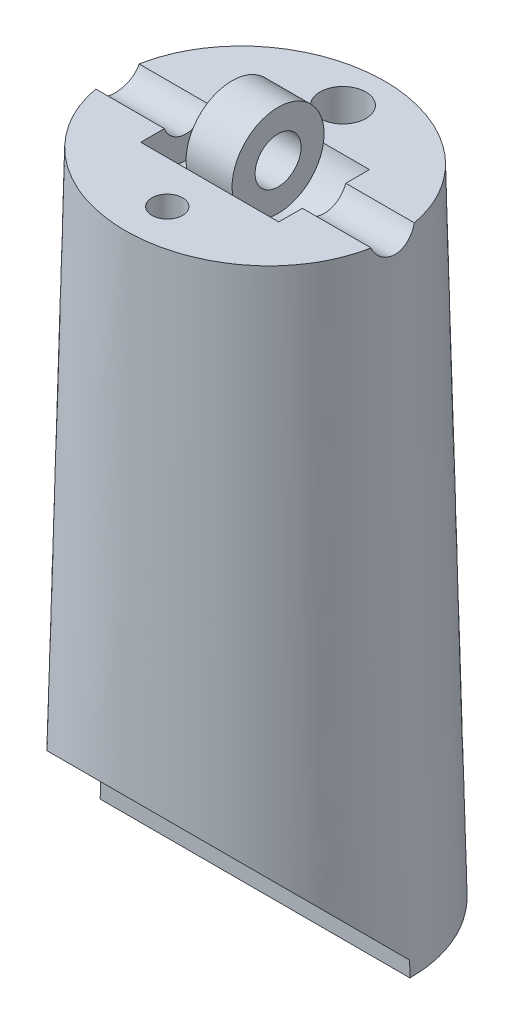
ISO-10303-21;
HEADER;
FILE_DESCRIPTION(('STEP AP214'),'2;1');
FILE_NAME('part.step','',(''),(''),'','','');
FILE_SCHEMA(('AUTOMOTIVE_DESIGN { 1 0 10303 214 1 1 1 1 }'));
ENDSEC;
DATA;
#1=APPLICATION_CONTEXT('core data for automotive mechanical design processes');
#2=APPLICATION_PROTOCOL_DEFINITION('international standard','automotive_design',2000,#1);
#3=PRODUCT_CONTEXT('',#1,'mechanical');
#4=PRODUCT('Part','Part','',(#3));
#5=PRODUCT_RELATED_PRODUCT_CATEGORY('part','',(#4));
#6=PRODUCT_DEFINITION_FORMATION('','',#4);
#7=PRODUCT_DEFINITION_CONTEXT('part definition',#1,'design');
#8=PRODUCT_DEFINITION('design','',#6,#7);
#9=PRODUCT_DEFINITION_SHAPE('','',#8);
#10=(LENGTH_UNIT() NAMED_UNIT(*) SI_UNIT(.MILLI.,.METRE.));
#11=(NAMED_UNIT(*) PLANE_ANGLE_UNIT() SI_UNIT($,.RADIAN.));
#12=(NAMED_UNIT(*) SI_UNIT($,.STERADIAN.) SOLID_ANGLE_UNIT());
#13=UNCERTAINTY_MEASURE_WITH_UNIT(LENGTH_MEASURE(1.E-05),#10,'distance_accuracy_value','');
#14=(GEOMETRIC_REPRESENTATION_CONTEXT(3) GLOBAL_UNCERTAINTY_ASSIGNED_CONTEXT((#13)) GLOBAL_UNIT_ASSIGNED_CONTEXT((#10,
#11,#12)) REPRESENTATION_CONTEXT('',''));
#15=CARTESIAN_POINT('',(0.,0.,0.));
#16=DIRECTION('',(0.,0.,1.));
#17=DIRECTION('',(1.,0.,0.));
#18=AXIS2_PLACEMENT_3D('',#15,#16,#17);
#19=CARTESIAN_POINT('',(-9.09999361964959,41.37,-0.0100033610871483));
#20=DIRECTION('',(0.,-1.,0.));
#21=DIRECTION('',(0.,0.,-1.));
#22=AXIS2_PLACEMENT_3D('',#19,#20,#21);
#23=PLANE('',#22);
#24=CARTESIAN_POINT('',(0.,41.37,-5.72535621924216));
#25=DIRECTION('',(0.,-1.,0.));
#26=DIRECTION('',(0.,0.,-1.));
#27=AXIS2_PLACEMENT_3D('',#24,#25,#26);
#28=CIRCLE('',#27,1.5);
#29=CARTESIAN_POINT('',(0.,41.37,-7.22535621924216));
#30=VERTEX_POINT('',#29);
#31=EDGE_CURVE('E192',#30,#30,#28,.T.);
#32=ORIENTED_EDGE('',*,*,#31,.T.);
#33=EDGE_LOOP('',(#32));
#34=FACE_BOUND('',#33,.T.);
#35=CARTESIAN_POINT('',(9.1,41.37,0.));
#36=CARTESIAN_POINT('',(9.1,41.37,-0.580347464535212));
#37=CARTESIAN_POINT('',(9.036262182866,41.37,-1.14968792087157));
#38=CARTESIAN_POINT('',(8.78760166390898,41.37,-2.26744117898492));
#39=CARTESIAN_POINT('',(8.59918245955483,41.37,-2.82137071074431));
#40=CARTESIAN_POINT('',(8.11621411040861,41.37,-3.86242450305594));
#41=CARTESIAN_POINT('',(7.82205175785362,41.37,-4.35381714198517));
#42=CARTESIAN_POINT('',(7.30325591728863,41.37,-5.04801492446734));
#43=CARTESIAN_POINT('',(7.11776372537932,41.37,-5.27130197974319));
#44=CARTESIAN_POINT('',(6.72911141856353,41.37,-5.6944304001868));
#45=CARTESIAN_POINT('',(6.52508179496951,41.37,-5.89547200287179));
#46=CARTESIAN_POINT('',(6.09822251987625,41.37,-6.2771681393339));
#47=CARTESIAN_POINT('',(5.87539128682259,41.37,-6.4578209580466));
#48=CARTESIAN_POINT('',(5.4109774213921,41.37,-6.79879226022297));
#49=CARTESIAN_POINT('',(5.1685531840289,41.37,-6.95947539316822));
#50=CARTESIAN_POINT('',(4.42726997661481,41.37,-7.40218910955545));
#51=CARTESIAN_POINT('',(3.91068550664822,41.37,-7.64848535396968));
#52=CARTESIAN_POINT('',(2.83456504973987,41.37,-8.04739811454503));
#53=CARTESIAN_POINT('',(2.2715400267804,41.37,-8.19973131789673));
#54=CARTESIAN_POINT('',(1.14345609259285,41.37,-8.39993958430221));
#55=CARTESIAN_POINT('',(0.573861118640256,41.37,-8.45007709935991));
#56=CARTESIAN_POINT('',(-0.288902208630634,41.37,-8.44996131802409));
#57=CARTESIAN_POINT('',(-0.579217858461627,41.37,-8.43710242721147));
#58=CARTESIAN_POINT('',(-1.15290365158946,41.37,-8.38614542752375));
#59=CARTESIAN_POINT('',(-1.43694755965754,41.37,-8.34817124470715));
#60=CARTESIAN_POINT('',(-2.28083086712952,41.37,-8.19742482196623));
#61=CARTESIAN_POINT('',(-2.83249871962043,41.37,-8.0481718820414));
#62=CARTESIAN_POINT('',(-3.6428583314134,41.37,-7.74776372474806));
#63=CARTESIAN_POINT('',(-3.91055675575723,41.37,-7.63440011499916));
#64=CARTESIAN_POINT('',(-4.42883270342353,41.37,-7.38621275584579));
#65=CARTESIAN_POINT('',(-4.68083425525248,41.37,-7.25093145639611));
#66=CARTESIAN_POINT('',(-5.41549884385493,41.37,-6.81163318045704));
#67=CARTESIAN_POINT('',(-5.87704859088978,41.37,-6.47451734017752));
#68=CARTESIAN_POINT('',(-6.52356766834694,41.37,-5.89703518559019));
#69=CARTESIAN_POINT('',(-6.73001887597164,41.37,-5.69347837168897));
#70=CARTESIAN_POINT('',(-7.11785020704172,41.37,-5.27117180780091));
#71=CARTESIAN_POINT('',(-7.30032602983707,41.37,-5.05146884863068));
#72=CARTESIAN_POINT('',(-7.6422544309206,41.37,-4.59485628560837));
#73=CARTESIAN_POINT('',(-7.80170942221602,41.37,-4.35794848514074));
#74=CARTESIAN_POINT('',(-8.09675755989889,41.37,-3.86629950339512));
#75=CARTESIAN_POINT('',(-8.23301164163947,41.37,-3.61009681780752));
#76=CARTESIAN_POINT('',(-8.59867767166947,41.37,-2.82357319218847));
#77=CARTESIAN_POINT('',(-8.78311239947049,41.37,-2.28226367512086));
#78=CARTESIAN_POINT('',(-8.97114354862367,41.37,-1.44497106979003));
#79=CARTESIAN_POINT('',(-9.01894169963419,41.37,-1.16162106746792));
#80=CARTESIAN_POINT('',(-9.08342568435033,41.37,-0.58602899951819));
#81=CARTESIAN_POINT('',(-9.09962770043713,41.37,-0.296854434632156));
#82=CARTESIAN_POINT('',(-9.10072545807449,41.37,0.563698786002849));
#83=CARTESIAN_POINT('',(-9.03914308748032,41.37,1.13278257973101));
#84=CARTESIAN_POINT('',(-8.85210906838486,41.37,1.97939260767821));
#85=CARTESIAN_POINT('',(-8.77386723736832,41.37,2.25940344946825));
#86=CARTESIAN_POINT('',(-8.58967842434559,41.37,2.8037843278194));
#87=CARTESIAN_POINT('',(-8.48339639183719,41.37,3.06981467445096));
#88=CARTESIAN_POINT('',(-8.24316512255972,41.37,3.58986260823514));
#89=CARTESIAN_POINT('',(-8.10921449654737,41.37,3.84387959219541));
#90=CARTESIAN_POINT('',(-7.81349804808534,41.37,4.33983654425585));
#91=CARTESIAN_POINT('',(-7.6515982101994,41.37,4.58157515621352));
#92=CARTESIAN_POINT('',(-7.13554700823715,41.37,5.27306558144373));
#93=CARTESIAN_POINT('',(-6.74815294660519,41.37,5.69513077212638));
#94=CARTESIAN_POINT('',(-6.10445474068028,41.37,6.27202005961662));
#95=CARTESIAN_POINT('',(-5.87843660691769,41.37,6.4554304772424));
#96=CARTESIAN_POINT('',(-5.41419080271481,41.37,6.79658555061589));
#97=CARTESIAN_POINT('',(-5.1751531891278,41.37,6.95519098482289));
#98=CARTESIAN_POINT('',(-4.43806025623445,41.37,7.3964138396821));
#99=CARTESIAN_POINT('',(-3.91822231496955,41.37,7.64546715893285));
#100=CARTESIAN_POINT('',(-2.83350125670802,41.37,8.04801545881971));
#101=CARTESIAN_POINT('',(-2.28030557828265,41.37,8.19760408470408));
#102=CARTESIAN_POINT('',(-1.43509789076522,41.37,8.3484587844185));
#103=CARTESIAN_POINT('',(-1.15077445002991,41.37,8.38640065052205));
#104=CARTESIAN_POINT('',(-0.576878125156588,41.37,8.43724363562835));
#105=CARTESIAN_POINT('',(-0.286383489288407,41.37,8.45004117500427));
#106=CARTESIAN_POINT('',(0.576981367346154,41.37,8.44991734776922));
#107=CARTESIAN_POINT('',(1.14648552503628,41.37,8.39955206726365));
#108=CARTESIAN_POINT('',(1.9917221182124,41.37,8.24931682648944));
#109=CARTESIAN_POINT('',(2.27195457678004,41.37,8.18670938876156));
#110=CARTESIAN_POINT('',(2.82928326786698,41.37,8.03552493677298));
#111=CARTESIAN_POINT('',(3.10562757323284,41.37,7.94698963909361));
#112=CARTESIAN_POINT('',(3.91304314000058,41.37,7.6474642762053));
#113=CARTESIAN_POINT('',(4.42822656494637,41.37,7.40147436959765));
#114=CARTESIAN_POINT('',(5.41129222028968,41.37,6.81464823825979));
#115=CARTESIAN_POINT('',(5.88319516162311,41.37,6.46930076812389));
#116=CARTESIAN_POINT('',(6.73763981133547,41.37,5.70554703540912));
#117=CARTESIAN_POINT('',(7.12437287799347,41.37,5.28593264759849));
#118=CARTESIAN_POINT('',(7.64074799593209,41.37,4.59711743617848));
#119=CARTESIAN_POINT('',(7.80304392743278,41.37,4.35603607538778));
#120=CARTESIAN_POINT('',(8.10019260152301,41.37,3.86025921620274));
#121=CARTESIAN_POINT('',(8.23464651240064,41.37,3.60663318333839));
#122=CARTESIAN_POINT('',(8.5962115761972,41.37,2.82877169479505));
#123=CARTESIAN_POINT('',(8.781984920232,41.37,2.28773929937144));
#124=CARTESIAN_POINT('',(9.03554627275881,41.37,1.15773310511271));
#125=CARTESIAN_POINT('',(9.1,41.37,0.580347464535211));
#126=CARTESIAN_POINT('',(9.1,41.37,0.));
#127=B_SPLINE_CURVE_WITH_KNOTS('',3,(#35,#36,#37,#38,#39,#40,#41,#42,#43,#44,#45,#46,#47,#48,
#49,#50,#51,#52,#53,#54,#55,#56,#57,#58,#59,#60,#61,#62,#63,#64,#65,#66,#67,#68,#69,#70,#71,#72,
#73,#74,#75,#76,#77,#78,#79,#80,#81,#82,#83,#84,#85,#86,#87,#88,#89,#90,#91,#92,#93,#94,#95,#96,
#97,#98,#99,#100,#101,#102,#103,#104,#105,#106,#107,#108,#109,#110,#111,#112,#113,#114,#115,
#116,#117,#118,#119,#120,#121,#122,#123,#124,#125,#126),.UNSPECIFIED.,.T.,.F.,(4,2,2,2,2,2,2,2,
2,2,2,2,2,2,2,2,2,2,2,2,2,2,2,2,2,2,2,2,2,2,2,2,2,2,2,2,2,2,2,2,2,2,2,2,2,4),(0.,
0.0312500000000001,0.0625000000000001,0.0937500000000002,0.109375,0.125,0.140625,0.15625,0.1875,
0.21875,0.25,0.265625,0.28125,0.3125,0.328125,0.34375,0.375,0.390625,0.40625,0.421875,0.4375,
0.46875,0.484375,0.5,0.53125,0.546875,0.5625,0.578125,0.59375,0.625,0.640625,0.65625,0.6875,
0.71875,0.734375,0.75,0.78125,0.796875,0.8125,0.84375,0.875,0.90625,0.921875,0.9375,0.96875,1.),.UNSPECIFIED.);
#128=CARTESIAN_POINT('',(8.97243681910451,41.37,-1.41421264117712));
#129=VERTEX_POINT('',#128);
#130=CARTESIAN_POINT('',(-8.97228566472608,41.37,-1.41421127162772));
#131=VERTEX_POINT('',#130);
#132=EDGE_CURVE('E144',#129,#131,#127,.T.);
#133=ORIENTED_EDGE('',*,*,#132,.T.);
#134=DIRECTION('',(1.,0.,0.));
#135=VECTOR('',#134,1.);
#136=CARTESIAN_POINT('',(-11.0957792956881,41.37,-1.4142135623731));
#137=LINE('',#136,#135);
#138=CARTESIAN_POINT('',(-4.5,41.37,-1.4142135623731));
#139=VERTEX_POINT('',#138);
#140=EDGE_CURVE('E133',#131,#139,#137,.T.);
#141=ORIENTED_EDGE('',*,*,#140,.T.);
#142=DIRECTION('',(0.,0.,-1.));
#143=VECTOR('',#142,1.);
#144=CARTESIAN_POINT('',(-4.5,41.37,-0.0100033610871483));
#145=LINE('',#144,#143);
#146=CARTESIAN_POINT('',(-4.5,41.37,-2.95803989154981));
#147=VERTEX_POINT('',#146);
#148=EDGE_CURVE('E141',#139,#147,#145,.T.);
#149=ORIENTED_EDGE('',*,*,#148,.T.);
#150=DIRECTION('',(1.,0.,0.));
#151=VECTOR('',#150,1.);
#152=CARTESIAN_POINT('',(-4.5,41.37,-2.95803989154981));
#153=LINE('',#152,#151);
#154=CARTESIAN_POINT('',(-1.5,41.37,-2.95803989154981));
#155=VERTEX_POINT('',#154);
#156=EDGE_CURVE('E259',#147,#155,#153,.T.);
#157=ORIENTED_EDGE('',*,*,#156,.T.);
#158=DIRECTION('',(-1.,0.,0.));
#159=VECTOR('',#158,1.);
#160=CARTESIAN_POINT('',(1.5,41.37,-2.95803989154981));
#161=LINE('',#160,#159);
#162=CARTESIAN_POINT('',(1.5,41.37,-2.95803989154981));
#163=VERTEX_POINT('',#162);
#164=EDGE_CURVE('E352',#163,#155,#161,.T.);
#165=ORIENTED_EDGE('',*,*,#164,.F.);
#166=DIRECTION('',(-1.,0.,0.));
#167=VECTOR('',#166,1.);
#168=CARTESIAN_POINT('',(4.5,41.37,-2.95803989154981));
#169=LINE('',#168,#167);
#170=CARTESIAN_POINT('',(4.5,41.37,-2.95803989154981));
#171=VERTEX_POINT('',#170);
#172=EDGE_CURVE('E265',#171,#163,#169,.T.);
#173=ORIENTED_EDGE('',*,*,#172,.F.);
#174=DIRECTION('',(0.,0.,1.));
#175=VECTOR('',#174,1.);
#176=CARTESIAN_POINT('',(4.5,41.37,-0.0100033610871483));
#177=LINE('',#176,#175);
#178=CARTESIAN_POINT('',(4.5,41.37,-1.4142135623731));
#179=VERTEX_POINT('',#178);
#180=EDGE_CURVE('E152',#171,#179,#177,.T.);
#181=ORIENTED_EDGE('',*,*,#180,.T.);
#182=EDGE_CURVE('E73',#179,#129,#137,.T.);
#183=ORIENTED_EDGE('',*,*,#182,.T.);
#184=EDGE_LOOP('',(#133,#141,#149,#157,#165,#173,#181,#183));
#185=FACE_BOUND('',#184,.T.);
#186=ADVANCED_FACE('F55',(#34,#185),#23,.F.);
#187=CARTESIAN_POINT('',(0.,41.37,5.72530197679048));
#188=DIRECTION('',(0.,-1.,0.));
#189=DIRECTION('',(0.,0.,-1.));
#190=AXIS2_PLACEMENT_3D('',#187,#188,#189);
#191=CIRCLE('',#190,1.);
#192=CARTESIAN_POINT('',(0.,41.37,4.72530197679048));
#193=VERTEX_POINT('',#192);
#194=EDGE_CURVE('E191',#193,#193,#191,.T.);
#195=ORIENTED_EDGE('',*,*,#194,.T.);
#196=EDGE_LOOP('',(#195));
#197=FACE_BOUND('',#196,.T.);
#198=CARTESIAN_POINT('',(-8.97225397067662,41.37,1.41421137929553));
#199=VERTEX_POINT('',#198);
#200=CARTESIAN_POINT('',(8.97222319785683,41.37,1.41421199482563));
#201=VERTEX_POINT('',#200);
#202=EDGE_CURVE('E165',#199,#201,#127,.T.);
#203=ORIENTED_EDGE('',*,*,#202,.T.);
#204=DIRECTION('',(1.,0.,0.));
#205=VECTOR('',#204,1.);
#206=CARTESIAN_POINT('',(-11.0957792956881,41.37,1.4142135623731));
#207=LINE('',#206,#205);
#208=CARTESIAN_POINT('',(4.5,41.37,1.4142135623731));
#209=VERTEX_POINT('',#208);
#210=EDGE_CURVE('E208',#201,#209,#207,.F.);
#211=ORIENTED_EDGE('',*,*,#210,.T.);
#212=CARTESIAN_POINT('',(4.5,41.37,2.95803989154981));
#213=VERTEX_POINT('',#212);
#214=EDGE_CURVE('E155',#209,#213,#177,.T.);
#215=ORIENTED_EDGE('',*,*,#214,.T.);
#216=DIRECTION('',(-1.,0.,0.));
#217=VECTOR('',#216,1.);
#218=CARTESIAN_POINT('',(4.5,41.37,2.95803989154981));
#219=LINE('',#218,#217);
#220=CARTESIAN_POINT('',(1.5,41.37,2.95803989154981));
#221=VERTEX_POINT('',#220);
#222=EDGE_CURVE('E269',#221,#213,#219,.F.);
#223=ORIENTED_EDGE('',*,*,#222,.F.);
#224=DIRECTION('',(-1.,0.,0.));
#225=VECTOR('',#224,1.);
#226=CARTESIAN_POINT('',(1.5,41.37,2.95803989154981));
#227=LINE('',#226,#225);
#228=CARTESIAN_POINT('',(-1.5,41.37,2.95803989154981));
#229=VERTEX_POINT('',#228);
#230=EDGE_CURVE('E357',#229,#221,#227,.F.);
#231=ORIENTED_EDGE('',*,*,#230,.F.);
#232=DIRECTION('',(1.,0.,0.));
#233=VECTOR('',#232,1.);
#234=CARTESIAN_POINT('',(-4.5,41.37,2.95803989154981));
#235=LINE('',#234,#233);
#236=CARTESIAN_POINT('',(-4.5,41.37,2.95803989154981));
#237=VERTEX_POINT('',#236);
#238=EDGE_CURVE('E255',#229,#237,#235,.F.);
#239=ORIENTED_EDGE('',*,*,#238,.T.);
#240=CARTESIAN_POINT('',(-4.5,41.37,1.4142135623731));
#241=VERTEX_POINT('',#240);
#242=EDGE_CURVE('E65',#237,#241,#145,.T.);
#243=ORIENTED_EDGE('',*,*,#242,.T.);
#244=EDGE_CURVE('E81',#241,#199,#207,.F.);
#245=ORIENTED_EDGE('',*,*,#244,.T.);
#246=EDGE_LOOP('',(#203,#211,#215,#223,#231,#239,#243,#245));
#247=FACE_BOUND('',#246,.T.);
#248=ADVANCED_FACE('F57',(#197,#247),#23,.F.);
#249=CARTESIAN_POINT('',(0.,0.,0.));
#250=DIRECTION('',(0.,1.,0.));
#251=DIRECTION('',(0.,0.,1.));
#252=AXIS2_PLACEMENT_3D('',#249,#250,#251);
#253=PLANE('',#252);
#254=CARTESIAN_POINT('',(0.,0.,-5.72535621924216));
#255=DIRECTION('',(0.,1.,0.));
#256=DIRECTION('',(0.,0.,1.));
#257=AXIS2_PLACEMENT_3D('',#254,#255,#256);
#258=CIRCLE('',#257,1.5);
#259=CARTESIAN_POINT('',(0.,0.,-4.22535621924216));
#260=VERTEX_POINT('',#259);
#261=EDGE_CURVE('E60',#260,#260,#258,.T.);
#262=ORIENTED_EDGE('',*,*,#261,.T.);
#263=EDGE_LOOP('',(#262));
#264=FACE_BOUND('',#263,.T.);
#265=CARTESIAN_POINT('',(0.,0.,0.));
#266=DIRECTION('',(0.,1.,0.));
#267=DIRECTION('',(-1.,0.,0.));
#268=AXIS2_PLACEMENT_3D('',#265,#266,#267);
#269=ELLIPSE('',#268,10.1,9.45);
#270=CARTESIAN_POINT('',(10.1,0.,0.));
#271=VERTEX_POINT('',#270);
#272=CARTESIAN_POINT('',(-10.0999783273345,0.,0.));
#273=VERTEX_POINT('',#272);
#274=EDGE_CURVE('E282',#271,#273,#269,.T.);
#275=ORIENTED_EDGE('',*,*,#274,.F.);
#276=DIRECTION('',(1.,0.,0.));
#277=VECTOR('',#276,1.);
#278=CARTESIAN_POINT('',(-10.1306474719909,0.,0.));
#279=LINE('',#278,#277);
#280=EDGE_CURVE('E276',#273,#271,#279,.T.);
#281=ORIENTED_EDGE('',*,*,#280,.F.);
#282=EDGE_LOOP('',(#275,#281));
#283=FACE_BOUND('',#282,.T.);
#284=ADVANCED_FACE('F317',(#264,#283),#253,.F.);
#285=CARTESIAN_POINT('',(10.1,0.,0.));
#286=CARTESIAN_POINT('',(9.76666666666667,13.79,0.));
#287=CARTESIAN_POINT('',(9.43333333333333,27.58,0.));
#288=CARTESIAN_POINT('',(9.1,41.37,0.));
#289=CARTESIAN_POINT('',(10.1,0.,-0.130389921094332));
#290=CARTESIAN_POINT('',(9.76666666666667,13.79,-0.125616445031902));
#291=CARTESIAN_POINT('',(9.43333333333333,27.58,-0.120842968969473));
#292=CARTESIAN_POINT('',(9.1,41.37,-0.116069492907043));
#293=CARTESIAN_POINT('',(10.0858737436222,0.,-0.779273416051286));
#294=CARTESIAN_POINT('',(9.75294165711937,13.79,-0.751279665630068));
#295=CARTESIAN_POINT('',(9.42000957061653,27.58,-0.72328591520885));
#296=CARTESIAN_POINT('',(9.08707748411369,41.37,-0.695292164787631));
#297=CARTESIAN_POINT('',(9.91899389838617,0.,-2.04383713923844));
#298=CARTESIAN_POINT('',(9.59056435479727,13.79,-1.97547929142748));
#299=CARTESIAN_POINT('',(9.26213481120838,27.58,-1.90712144361651));
#300=CARTESIAN_POINT('',(8.93370526761949,41.37,-1.83876359580555));
#301=CARTESIAN_POINT('',(9.36258436868433,0.,-3.70492913082597));
#302=CARTESIAN_POINT('',(9.04663332524787,13.79,-3.59139655330119));
#303=CARTESIAN_POINT('',(8.7306822818114,27.58,-3.47786397577641));
#304=CARTESIAN_POINT('',(8.41473123837494,41.37,-3.36433139825164));
#305=CARTESIAN_POINT('',(8.42512662708514,0.,-5.31644736537081));
#306=CARTESIAN_POINT('',(8.12406821247913,13.79,-5.16207989821203));
#307=CARTESIAN_POINT('',(7.82300979787313,27.58,-5.00771243105326));
#308=CARTESIAN_POINT('',(7.52195138326713,41.37,-4.85334496389449));
#309=CARTESIAN_POINT('',(7.18257569619234,0.,-6.72158581625363));
#310=CARTESIAN_POINT('',(6.9048265214771,13.79,-6.5238828794093));
#311=CARTESIAN_POINT('',(6.62707734676187,27.58,-6.32617994256497));
#312=CARTESIAN_POINT('',(6.34932817204664,41.37,-6.12847700572064));
#313=CARTESIAN_POINT('',(5.68468132710744,0.,-7.88228650788105));
#314=CARTESIAN_POINT('',(5.43974938974552,13.79,-7.6390387674443));
#315=CARTESIAN_POINT('',(5.1948174523836,27.58,-7.39579102700755));
#316=CARTESIAN_POINT('',(4.94988551502168,41.37,-7.15254328657081));
#317=CARTESIAN_POINT('',(3.95496943253776,0.,-8.76030094713334));
#318=CARTESIAN_POINT('',(3.76616978005767,13.79,-8.472814309565));
#319=CARTESIAN_POINT('',(3.57737012757758,27.58,-8.18532767199666));
#320=CARTESIAN_POINT('',(3.38857047509749,41.37,-7.89784103442831));
#321=CARTESIAN_POINT('',(2.0666001244506,0.,-9.31773701538679));
#322=CARTESIAN_POINT('',(1.95071490281053,13.79,-8.99485541368581));
#323=CARTESIAN_POINT('',(1.83482968117045,27.58,-8.67197381198482));
#324=CARTESIAN_POINT('',(1.71894445953037,41.37,-8.34909221028384));
#325=CARTESIAN_POINT('',(4.5864593611715E-07,0.,-9.51606832170796));
#326=CARTESIAN_POINT('',(-0.00137524648464856,13.79,-9.17769414159611));
#327=CARTESIAN_POINT('',(-0.00275095161523323,27.58,-8.83931996148425));
#328=CARTESIAN_POINT('',(-0.00412665674581791,41.37,-8.50094578137239));
#329=CARTESIAN_POINT('',(-2.06660130015111,0.,-9.31785433127716));
#330=CARTESIAN_POINT('',(-1.95299319969982,13.79,-8.9945864591611));
#331=CARTESIAN_POINT('',(-1.83938509924852,27.58,-8.67131858704504));
#332=CARTESIAN_POINT('',(-1.72577699879723,41.37,-8.34805071492898));
#333=CARTESIAN_POINT('',(-3.9549674315056,0.,-8.75995896798664));
#334=CARTESIAN_POINT('',(-3.76759187490447,13.79,-8.47199794020148));
#335=CARTESIAN_POINT('',(-3.58021631830335,27.58,-8.18403691241631));
#336=CARTESIAN_POINT('',(-3.39284076170222,41.37,-7.89607588463115));
#337=CARTESIAN_POINT('',(-5.68468495837564,0.,-7.88299526021272));
#338=CARTESIAN_POINT('',(-5.44050735243015,13.79,-7.6388935615273));
#339=CARTESIAN_POINT('',(-5.19632974648466,27.58,-7.39479186284187));
#340=CARTESIAN_POINT('',(-4.95215214053917,41.37,-7.15069016415645));
#341=CARTESIAN_POINT('',(-7.18256897922326,0.,-6.72022628079781));
#342=CARTESIAN_POINT('',(-6.90378897240166,13.79,-6.52393209108786));
#343=CARTESIAN_POINT('',(-6.62500896558006,27.58,-6.32763790137791));
#344=CARTESIAN_POINT('',(-6.34622895875846,41.37,-6.13134371166796));
#345=CARTESIAN_POINT('',(-8.42513906299441,0.,-5.31898608035199));
#346=CARTESIAN_POINT('',(-8.12262238859977,13.79,-5.16515294867757));
#347=CARTESIAN_POINT('',(-7.82010571420514,27.58,-5.01131981700316));
#348=CARTESIAN_POINT('',(-7.5175890398105,41.37,-4.85748668532874));
#349=CARTESIAN_POINT('',(-9.36256181991699,0.,-3.70035034369416));
#350=CARTESIAN_POINT('',(-9.04515876626033,13.79,-3.59235703312478));
#351=CARTESIAN_POINT('',(-8.72775571260367,27.58,-3.48436372255539));
#352=CARTESIAN_POINT('',(-8.41035265894701,41.37,-3.37637041198601));
#353=CARTESIAN_POINT('',(-9.95877455428835,0.,-1.93249268844865));
#354=CARTESIAN_POINT('',(-9.62872973333213,13.79,-1.86674386512808));
#355=CARTESIAN_POINT('',(-9.29868491237592,27.58,-1.80099504180752));
#356=CARTESIAN_POINT('',(-8.9686400914197,41.37,-1.73524621848695));
#357=CARTESIAN_POINT('',(-10.1705477048593,0.,0.));
#358=CARTESIAN_POINT('',(-9.83553477618623,13.79,-0.00433859948019328));
#359=CARTESIAN_POINT('',(-9.50052184751312,27.5799999999999,-0.00867719896038655));
#360=CARTESIAN_POINT('',(-9.16550891884001,41.3699999999999,-0.0130157984405798));
#361=CARTESIAN_POINT('',(-9.95877455428834,0.,1.93249268844864));
#362=CARTESIAN_POINT('',(-9.63052194379868,13.79,1.85880151048046));
#363=CARTESIAN_POINT('',(-9.30226933330902,27.58,1.78511033251229));
#364=CARTESIAN_POINT('',(-8.97401672281937,41.37,1.71141915454412));
#365=CARTESIAN_POINT('',(-9.362561819917,0.,3.70035034369416));
#366=CARTESIAN_POINT('',(-9.04824408892896,13.79,3.5860507517597));
#367=CARTESIAN_POINT('',(-8.73392635794093,27.58,3.47175115982523));
#368=CARTESIAN_POINT('',(-8.41960862695289,41.3700000000001,3.35745156789076));
#369=CARTESIAN_POINT('',(-8.42513906299441,0.,5.31898608035197));
#370=CARTESIAN_POINT('',(-8.12600262694151,13.79,5.16081550990898));
#371=CARTESIAN_POINT('',(-7.8268661908886,27.58,5.00264493946598));
#372=CARTESIAN_POINT('',(-7.5277297548357,41.37,4.84447436902299));
#373=CARTESIAN_POINT('',(-7.18256897922326,0.,6.72022628079782));
#374=CARTESIAN_POINT('',(-6.90666109038852,13.79,6.52151133326607));
#375=CARTESIAN_POINT('',(-6.63075320155379,27.5799999999999,6.32279638573432));
#376=CARTESIAN_POINT('',(-6.35484531271906,41.3699999999999,6.12408143820257));
#377=CARTESIAN_POINT('',(-5.68468495837566,0.,7.8829952602127));
#378=CARTESIAN_POINT('',(-5.44226347453518,13.79,7.63795239203889));
#379=CARTESIAN_POINT('',(-5.19984199069471,27.58,7.39290952386508));
#380=CARTESIAN_POINT('',(-4.95742050685423,41.37,7.14786665569126));
#381=CARTESIAN_POINT('',(-3.9549674315056,0.,8.75995896798667));
#382=CARTESIAN_POINT('',(-3.76807368512744,13.79,8.47195072439181));
#383=CARTESIAN_POINT('',(-3.58117993874928,27.5800000000001,8.18394248079695));
#384=CARTESIAN_POINT('',(-3.39428619237113,41.3700000000001,7.89593423720209));
#385=CARTESIAN_POINT('',(-2.06660130015112,0.,9.31785433127715));
#386=CARTESIAN_POINT('',(-1.95249194156729,13.79,8.99469902033412));
#387=CARTESIAN_POINT('',(-1.83838258298346,27.58,8.67154370939109));
#388=CARTESIAN_POINT('',(-1.72427322439962,41.37,8.34838839844807));
#389=CARTESIAN_POINT('',(4.58645932430862E-07,0.,9.51606832170797));
#390=CARTESIAN_POINT('',(-0.000382575435584072,13.79,9.17765278204098));
#391=CARTESIAN_POINT('',(-0.000765609517100575,27.5799999999999,8.83923724237399));
#392=CARTESIAN_POINT('',(-0.00114864359861708,41.3699999999999,8.500821702707));
#393=CARTESIAN_POINT('',(2.0666001244506,0.,9.3177370153868));
#394=CARTESIAN_POINT('',(1.95150691942473,13.79,8.99476691467677));
#395=CARTESIAN_POINT('',(1.83641371439887,27.58,8.67179681396673));
#396=CARTESIAN_POINT('',(1.72132050937301,41.37,8.3488267132567));
#397=CARTESIAN_POINT('',(3.95496943253776,0.,8.76030094713332));
#398=CARTESIAN_POINT('',(3.76651364338803,13.79,8.47269637930929));
#399=CARTESIAN_POINT('',(3.5780578542383,27.58,8.18509181148526));
#400=CARTESIAN_POINT('',(3.38960206508856,41.37,7.89748724366124));
#401=CARTESIAN_POINT('',(5.68468132710743,0.,7.88228650788108));
#402=CARTESIAN_POINT('',(5.43984216944541,13.79,7.63882004108228));
#403=CARTESIAN_POINT('',(5.19500301178339,27.58,7.39535357428348));
#404=CARTESIAN_POINT('',(4.95016385412136,41.37,7.15188710748467));
#405=CARTESIAN_POINT('',(7.18257569619234,0.,6.72158581625362));
#406=CARTESIAN_POINT('',(6.90345809667734,13.79,6.52509761832796));
#407=CARTESIAN_POINT('',(6.62434049716235,27.5799999999999,6.32860942040231));
#408=CARTESIAN_POINT('',(6.34522289764735,41.3699999999999,6.13212122247665));
#409=CARTESIAN_POINT('',(8.42512662708513,0.,5.31644736537082));
#410=CARTESIAN_POINT('',(8.12241649033758,13.79,5.16372641237615));
#411=CARTESIAN_POINT('',(7.81970635359002,27.58,5.01100545938148));
#412=CARTESIAN_POINT('',(7.51699621684247,41.37,4.8582845063868));
#413=CARTESIAN_POINT('',(9.36258436868432,0.,3.70492913082596));
#414=CARTESIAN_POINT('',(9.04510051521078,13.79,3.59561804941654));
#415=CARTESIAN_POINT('',(8.72761666173724,27.58,3.48630696800711));
#416=CARTESIAN_POINT('',(8.4101328082637,41.37,3.37699588659769));
#417=CARTESIAN_POINT('',(9.91899389838616,0.,2.04383713923845));
#418=CARTESIAN_POINT('',(9.58999762485335,13.79,1.97734111401415));
#419=CARTESIAN_POINT('',(9.26100135132055,27.58,1.91084508878986));
#420=CARTESIAN_POINT('',(8.93200507778776,41.37,1.84434906356556));
#421=CARTESIAN_POINT('',(10.0858737436222,0.,0.779273416051289));
#422=CARTESIAN_POINT('',(9.75289188469707,13.79,0.751448993077818));
#423=CARTESIAN_POINT('',(9.41991002577194,27.58,0.723624570104346));
#424=CARTESIAN_POINT('',(9.08692816684681,41.37,0.695800147130875));
#425=CARTESIAN_POINT('',(10.1,0.,0.130389921094334));
#426=CARTESIAN_POINT('',(9.76666666666667,13.79,0.125616445031904));
#427=CARTESIAN_POINT('',(9.43333333333333,27.58,0.120842968969474));
#428=CARTESIAN_POINT('',(9.1,41.37,0.116069492907043));
#429=CARTESIAN_POINT('',(10.1,0.,0.));
#430=CARTESIAN_POINT('',(9.76666666666667,13.79,0.));
#431=CARTESIAN_POINT('',(9.43333333333333,27.58,0.));
#432=CARTESIAN_POINT('',(9.1,41.37,0.));
#433=B_SPLINE_SURFACE_WITH_KNOTS('',3,3,((#285,#286,#287,#288),(#289,#290,#291,#292),(#293,#294,
#295,#296),(#297,#298,#299,#300),(#301,#302,#303,#304),(#305,#306,#307,#308),(#309,#310,#311,
#312),(#313,#314,#315,#316),(#317,#318,#319,#320),(#321,#322,#323,#324),(#325,#326,#327,#328),
(#329,#330,#331,#332),(#333,#334,#335,#336),(#337,#338,#339,#340),(#341,#342,#343,#344),(#345,
#346,#347,#348),(#349,#350,#351,#352),(#353,#354,#355,#356),(#357,#358,#359,#360),(#361,#362,
#363,#364),(#365,#366,#367,#368),(#369,#370,#371,#372),(#373,#374,#375,#376),(#377,#378,#379,
#380),(#381,#382,#383,#384),(#385,#386,#387,#388),(#389,#390,#391,#392),(#393,#394,#395,#396),
(#397,#398,#399,#400),(#401,#402,#403,#404),(#405,#406,#407,#408),(#409,#410,#411,#412),(#413,
#414,#415,#416),(#417,#418,#419,#420),(#421,#422,#423,#424),(#425,#426,#427,#428),(#429,#430,
#431,#432)),.UNSPECIFIED.,.T.,.F.,.F.,(4,1,1,1,1,1,1,1,1,1,1,1,1,1,1,1,1,1,1,1,1,1,1,1,1,1,1,1,
1,1,1,1,1,1,4),(4,4),(0.,0.00625000000000009,0.03125,0.0625,0.09375,0.125,0.15625,0.1875,
0.21875,0.25,0.28125,0.3125,0.34375,0.375,0.40625,0.4375,0.46875,0.5,0.53125,0.5625,0.59375,
0.625,0.65625,0.6875,0.71875,0.75,0.78125,0.8125,0.84375,0.875,0.90625,0.9375,0.96875,0.99375,
1.),(0.,1.),.UNSPECIFIED.);
#434=CARTESIAN_POINT('',(8.97095474272741,41.37,1.4142135623731));
#435=CARTESIAN_POINT('',(8.97452828324246,41.3299937198987,1.40006878592912));
#436=CARTESIAN_POINT('',(8.97835663561133,41.2906286613301,1.38424068394254));
#437=CARTESIAN_POINT('',(8.98642752560645,41.2134179835879,1.34933194242742));
#438=CARTESIAN_POINT('',(8.99067001180482,41.1755721765726,1.33025170653571));
#439=CARTESIAN_POINT('',(9.0038629089694,41.064772616981,1.26836407457178));
#440=CARTESIAN_POINT('',(9.01329079689883,40.9944272963915,1.22086378099203));
#441=CARTESIAN_POINT('',(9.03248820547096,40.8627843344438,1.11475347366349));
#442=CARTESIAN_POINT('',(9.04225777799402,40.8014880745094,1.0561417667663));
#443=CARTESIAN_POINT('',(9.06117891932023,40.6895821062432,0.929384528515885));
#444=CARTESIAN_POINT('',(9.07033055701375,40.6389712053132,0.861240062531478));
#445=CARTESIAN_POINT('',(9.08712035687149,40.5497633916204,0.717064375100128));
#446=CARTESIAN_POINT('',(9.09475439351253,40.5111990687718,0.641012488885126));
#447=CARTESIAN_POINT('',(9.10768606353499,40.4474476029706,0.483297816790922));
#448=CARTESIAN_POINT('',(9.11298372577827,40.4222602947673,0.401635100238247));
#449=CARTESIAN_POINT('',(9.12060664429327,40.3863981678418,0.236517633171912));
#450=CARTESIAN_POINT('',(9.12298130076107,40.3754819580913,0.15311760459566));
#451=CARTESIAN_POINT('',(9.12466535698001,40.3677288238896,-0.0143574401273414));
#452=CARTESIAN_POINT('',(9.12397519488586,40.3708898869137,-0.0984323580747122));
#453=CARTESIAN_POINT('',(9.11966639854652,40.3910241749975,-0.263514802892873));
#454=CARTESIAN_POINT('',(9.1160928638472,40.407784709848,-0.344549601779494));
#455=CARTESIAN_POINT('',(9.10642908676721,40.4543185610843,-0.502628311548366));
#456=CARTESIAN_POINT('',(9.10033882476182,40.4840919789409,-0.579672191305294));
#457=CARTESIAN_POINT('',(9.08618461228391,40.5560519256933,-0.728294751412278));
#458=CARTESIAN_POINT('',(9.07810517485425,40.5983364089342,-0.799824467761295));
#459=CARTESIAN_POINT('',(9.06078073270534,40.6940497037036,-0.934876157500578));
#460=CARTESIAN_POINT('',(9.05153520688444,40.7474835046692,-0.998394525239448));
#461=CARTESIAN_POINT('',(9.03257051280575,40.8652447104743,-1.11695836526932));
#462=CARTESIAN_POINT('',(9.02284550773199,40.9297741505638,-1.17180195556663));
#463=CARTESIAN_POINT('',(9.00406683911826,41.0671451818625,-1.26985114049586));
#464=CARTESIAN_POINT('',(8.99501216134022,41.1399737737223,-1.3130745890175));
#465=CARTESIAN_POINT('',(8.98399881988486,41.2409565213006,-1.36201496298599));
#466=CARTESIAN_POINT('',(8.98134894373675,41.2663658466129,-1.37346444380097));
#467=CARTESIAN_POINT('',(8.97624640526573,41.3177581830354,-1.3949196968166));
#468=CARTESIAN_POINT('',(8.97379343491536,41.3437402137368,-1.40492774419076));
#469=CARTESIAN_POINT('',(8.97144859144298,41.37,-1.4142135623731));
#470=B_SPLINE_CURVE_WITH_KNOTS('',3,(#434,#435,#436,#437,#438,#439,#440,#441,#442,#443,#444,
#445,#446,#447,#448,#449,#450,#451,#452,#453,#454,#455,#456,#457,#458,#459,#460,#461,#462,#463,
#464,#465,#466,#467,#468,#469),.UNSPECIFIED.,.F.,.F.,(4,2,2,2,2,2,2,2,2,2,2,2,2,2,2,2,2,4),(0.,
0.127668815380748,0.255321796738926,0.510219430442271,0.765155936511307,1.02006397393426,
1.275655764917,1.53124439841594,1.78245137243839,2.03362243439248,2.28093930799909,
2.52825811014863,2.77756696224561,3.02698762288647,3.281555021987,3.53572902346042,
3.61968358097183,3.70350413633831),.UNSPECIFIED.);
#471=EDGE_CURVE('E214',#201,#129,#470,.T.);
#472=CARTESIAN_POINT('',(-8.97114409341658,41.37,-1.41421356237309));
#473=CARTESIAN_POINT('',(-8.97472533749458,41.3299926587824,-1.40006841199672));
#474=CARTESIAN_POINT('',(-8.97856232129939,41.2906266968617,-1.38423988851434));
#475=CARTESIAN_POINT('',(-8.98665230885021,41.2134145443636,-1.34933029463158));
#476=CARTESIAN_POINT('',(-8.99090526069854,41.1755681650265,-1.33024962976007));
#477=CARTESIAN_POINT('',(-9.00413221229936,41.0647676431074,-1.26836096994563));
#478=CARTESIAN_POINT('',(-9.0135864020253,40.9944223537963,-1.22086021763189));
#479=CARTESIAN_POINT('',(-9.03284294479137,40.8627803290564,-1.11474982383259));
#480=CARTESIAN_POINT('',(-9.04264534976708,40.8014849504922,-1.05613851953048));
#481=CARTESIAN_POINT('',(-9.06163689514521,40.689580529413,-0.929382451261867));
#482=CARTESIAN_POINT('',(-9.070826102483,40.638970319218,-0.861238730356835));
#483=CARTESIAN_POINT('',(-9.08769255738586,40.5497603669662,-0.717059386524421));
#484=CARTESIAN_POINT('',(-9.095365580604,40.5111940125602,-0.641002590809014));
#485=CARTESIAN_POINT('',(-9.10836794570923,40.4474398335448,-0.483275985891808));
#486=CARTESIAN_POINT('',(-9.11369731700065,40.4222518410846,-0.40160624712696));
#487=CARTESIAN_POINT('',(-9.1213668403595,40.3863925178029,-0.236481718206546));
#488=CARTESIAN_POINT('',(-9.12375696470456,40.375478298433,-0.153082012305526));
#489=CARTESIAN_POINT('',(-9.12543795662975,40.3677292324689,0.0143920786640512));
#490=CARTESIAN_POINT('',(-9.12472928976695,40.370892270933,0.0984663604911234));
#491=CARTESIAN_POINT('',(-9.12033869133265,40.391024797075,0.26350566713955));
#492=CARTESIAN_POINT('',(-9.11670394086056,40.4077752297272,0.344498833930125));
#493=CARTESIAN_POINT('',(-9.1069064663634,40.4542743823259,0.50249677676352));
#494=CARTESIAN_POINT('',(-9.10074370420496,40.4840232983464,0.579501492623479));
#495=CARTESIAN_POINT('',(-9.08644422354315,40.555932240289,0.728076574568691));
#496=CARTESIAN_POINT('',(-9.0782914123206,40.5981940786765,0.799596051634575));
#497=CARTESIAN_POINT('',(-9.06083165233603,40.6938581236951,0.934633339470862));
#498=CARTESIAN_POINT('',(-9.05152418946596,40.7472653000541,0.998147560348458));
#499=CARTESIAN_POINT('',(-9.03244520120372,40.8649939441145,1.11673363821942));
#500=CARTESIAN_POINT('',(-9.02266803368167,40.9295212266717,1.17159998139455));
#501=CARTESIAN_POINT('',(-9.00379987380847,41.0668948356656,1.26969375502577));
#502=CARTESIAN_POINT('',(-8.99470784522422,41.1397281625427,1.31293902668256));
#503=CARTESIAN_POINT('',(-8.98364952789874,41.2407561180284,1.36192329145232));
#504=CARTESIAN_POINT('',(-8.98098656243337,41.2662040435338,1.37339421675426));
#505=CARTESIAN_POINT('',(-8.97585974249525,41.317675733295,1.39488792899191));
#506=CARTESIAN_POINT('',(-8.97339557689738,41.3436985132526,1.40491299887895));
#507=CARTESIAN_POINT('',(-8.97104047680941,41.37,1.4142135623731));
#508=B_SPLINE_CURVE_WITH_KNOTS('',3,(#472,#473,#474,#475,#476,#477,#478,#479,#480,#481,#482,
#483,#484,#485,#486,#487,#488,#489,#490,#491,#492,#493,#494,#495,#496,#497,#498,#499,#500,#501,
#502,#503,#504,#505,#506,#507),.UNSPECIFIED.,.F.,.F.,(4,2,2,2,2,2,2,2,2,2,2,2,2,2,2,2,2,4),(0.,
0.127674099862696,0.255332290913618,0.510239285901136,0.765184460692256,1.02010176051845,
1.27571958762696,1.53133420756701,1.78254001590081,2.03370808480276,2.28090546751593,
2.5281065791741,2.77737708768644,3.02675898481396,3.28138271393961,3.53561327034271,
3.61970277849638,3.70365802371092),.UNSPECIFIED.);
#509=EDGE_CURVE('E146',#131,#199,#508,.T.);
#510=DIRECTION('',(-0.0241650467155316,0.999707982621543,0.));
#511=VECTOR('',#510,1.);
#512=CARTESIAN_POINT('',(9.6,20.685,0.));
#513=LINE('',#512,#511);
#514=CARTESIAN_POINT('',(10.0758278946096,1.,0.));
#515=VERTEX_POINT('',#514);
#516=EDGE_CURVE('E349',#271,#515,#513,.T.);
#517=CARTESIAN_POINT('',(-10.0758045065753,1.,0.));
#518=CARTESIAN_POINT('',(-10.0838552226065,0.666666666666667,0.));
#519=CARTESIAN_POINT('',(-10.0919059386378,0.333333333333334,0.));
#520=CARTESIAN_POINT('',(-10.099956654669,0.,0.));
#521=B_SPLINE_CURVE_WITH_KNOTS('',3,(#517,#518,#519,#520),.UNSPECIFIED.,.F.,.F.,(4,4),(0.,
1.00029162060748),.UNSPECIFIED.);
#522=CARTESIAN_POINT('',(-10.0758045065753,1.,0.));
#523=VERTEX_POINT('',#522);
#524=EDGE_CURVE('E182',#523,#273,#521,.T.);
#525=CARTESIAN_POINT('',(10.0758278946096,1.,0.));
#526=CARTESIAN_POINT('',(10.0676295675781,1.34013778266717,0.340137782667176));
#527=CARTESIAN_POINT('',(10.0400889709757,1.68012427771292,0.680124277712923));
#528=CARTESIAN_POINT('',(9.94534196261292,2.35770917852686,1.35770917852688));
#529=CARTESIAN_POINT('',(9.87808949115321,2.69530434985258,1.69530434985259));
#530=CARTESIAN_POINT('',(9.70227125658,3.36782345169951,2.36782345169954));
#531=CARTESIAN_POINT('',(9.59338832684887,3.70270620130843,2.70270620130846));
#532=CARTESIAN_POINT('',(9.33359954778721,4.36409622440206,3.3640962244021));
#533=CARTESIAN_POINT('',(9.18271686864595,4.69060800777931,3.69060800777934));
#534=CARTESIAN_POINT('',(8.87985961100523,5.25388377723694,4.25388377723698));
#535=CARTESIAN_POINT('',(8.7371018762409,5.49313728135707,4.49313728135711));
#536=CARTESIAN_POINT('',(8.42634919299322,5.9633340120954,4.96333401209545));
#537=CARTESIAN_POINT('',(8.25835482386501,6.19427742933669,5.19427742933675));
#538=CARTESIAN_POINT('',(7.89717782540978,6.64532139331897,5.64532139331903));
#539=CARTESIAN_POINT('',(7.70406680110141,6.86545040205931,5.86545040205937));
#540=CARTESIAN_POINT('',(7.39521186494972,7.18630400012717,6.18630400012724));
#541=CARTESIAN_POINT('',(7.28906698704135,7.29169434008277,6.29169434008284));
#542=CARTESIAN_POINT('',(7.07030630891059,7.49910934804337,6.49910934804344));
#543=CARTESIAN_POINT('',(6.9576888536791,7.60113314464654,6.60113314464661));
#544=CARTESIAN_POINT('',(6.66260456766211,7.85620450874485,6.85620450874493));
#545=CARTESIAN_POINT('',(6.47560806731057,8.00665633179824,7.00665633179832));
#546=CARTESIAN_POINT('',(6.08603379043098,8.29706052529348,7.29706052529355));
#547=CARTESIAN_POINT('',(5.88346021889356,8.43701570926506,7.43701570926514));
#548=CARTESIAN_POINT('',(5.46293279318668,8.70469933602852,7.7046993360286));
#549=CARTESIAN_POINT('',(5.24498865614156,8.83243538537994,7.83243538538002));
#550=CARTESIAN_POINT('',(4.7943369855875,9.0741863817812,8.07418638178129));
#551=CARTESIAN_POINT('',(4.56163031723408,9.18820213177438,8.18820213177447));
#552=CARTESIAN_POINT('',(4.12449040975514,9.38225437356383,8.38225437356392));
#553=CARTESIAN_POINT('',(3.92223300916841,9.46474583204954,8.46474583204963));
#554=CARTESIAN_POINT('',(3.50917481033585,9.61820778431607,8.61820778431616));
#555=CARTESIAN_POINT('',(3.29837571307756,9.68918055796627,8.68918055796637));
#556=CARTESIAN_POINT('',(2.86912135934521,9.81833425857821,8.81833425857831));
#557=CARTESIAN_POINT('',(2.65066944833831,9.8765206962062,8.87652069620629));
#558=CARTESIAN_POINT('',(2.31825600039409,9.95347054466175,8.95347054466185));
#559=CARTESIAN_POINT('',(2.20664498344494,9.97740170254344,8.97740170254353));
#560=CARTESIAN_POINT('',(1.98202660547819,10.0217275683219,9.02172756832199));
#561=CARTESIAN_POINT('',(1.86901924177327,10.0421222694115,9.04212226941156));
#562=CARTESIAN_POINT('',(1.52726135111699,10.0980943637066,9.09809436370665));
#563=CARTESIAN_POINT('',(1.29668954004214,10.1282477792272,9.1282477792273));
#564=CARTESIAN_POINT('',(0.832646908258189,10.173841359417,9.17384135941708));
#565=CARTESIAN_POINT('',(0.59917610037843,10.1892815891749,9.18928158917505));
#566=CARTESIAN_POINT('',(0.248257298840872,10.2011359741724,9.2011359741725));
#567=CARTESIAN_POINT('',(0.131147298134276,10.2032025499015,9.20320254990158));
#568=CARTESIAN_POINT('',(-0.103082981545822,10.2035120329918,9.2035120329919));
#569=CARTESIAN_POINT('',(-0.220203259376677,10.2017551858385,9.2017551858386));
#570=CARTESIAN_POINT('',(-0.454194154946325,10.194466542717,9.1944665427171));
#571=CARTESIAN_POINT('',(-0.571064799416322,10.1889351735963,9.18893517359636));
#572=CARTESIAN_POINT('',(-0.804355756486675,10.1741441891315,9.1741441891316));
#573=CARTESIAN_POINT('',(-0.920775944670338,10.1648836089734,9.16488360897354));
#574=CARTESIAN_POINT('',(-1.25297354643138,10.1331093741346,9.13310937413473));
#575=CARTESIAN_POINT('',(-1.46791795989922,10.1060518818521,9.10605188185224));
#576=CARTESIAN_POINT('',(-1.89383016506082,10.0393523660552,9.03935236605533));
#577=CARTESIAN_POINT('',(-2.10479808411912,9.99971074633036,8.99971074633046));
#578=CARTESIAN_POINT('',(-2.521337895305,9.90823930390328,8.90823930390337));
#579=CARTESIAN_POINT('',(-2.72691068709707,9.85641152784451,8.8564115278446));
#580=CARTESIAN_POINT('',(-3.13158811328959,9.74137946973413,8.74137946973423));
#581=CARTESIAN_POINT('',(-3.33069193745031,9.67817376902967,8.67817376902977));
#582=CARTESIAN_POINT('',(-3.72784116117935,9.53922256548432,8.53922256548441));
#583=CARTESIAN_POINT('',(-3.925651593489,9.46314223318373,8.46314223318382));
#584=CARTESIAN_POINT('',(-4.31285140733305,9.30096797808133,8.30096797808142));
#585=CARTESIAN_POINT('',(-4.50224102291525,9.21487433382985,8.21487433382994));
#586=CARTESIAN_POINT('',(-4.87208002344345,9.03344302107627,8.03344302107635));
#587=CARTESIAN_POINT('',(-5.05252478912219,8.93810064999954,7.93810064999963));
#588=CARTESIAN_POINT('',(-5.40384823808164,8.73898399766758,7.73898399766766));
#589=CARTESIAN_POINT('',(-5.57472601290687,8.6352089179511,7.63520891795118));
#590=CARTESIAN_POINT('',(-5.98720872545556,8.36782512219973,7.36782512219981));
#591=CARTESIAN_POINT('',(-6.22288602789417,8.19962287927548,7.19962287927557));
#592=CARTESIAN_POINT('',(-6.67260380931869,7.84929706859846,6.84929706859853));
#593=CARTESIAN_POINT('',(-6.88663375193406,7.66716679670194,6.66716679670201));
#594=CARTESIAN_POINT('',(-7.29367692658746,7.29100641474342,6.29100641474349));
#595=CARTESIAN_POINT('',(-7.48665017150241,7.09695472105055,6.09695472105062));
#596=CARTESIAN_POINT('',(-7.85091815543236,6.69900369192766,5.69900369192772));
#597=CARTESIAN_POINT('',(-8.02221579619231,6.49510567969885,5.49510567969891));
#598=CARTESIAN_POINT('',(-8.38821427367383,6.02053603575395,5.02053603575401));
#599=CARTESIAN_POINT('',(-8.57598698493882,5.74718696621865,4.7471869662187));
#600=CARTESIAN_POINT('',(-8.91762113570698,5.19003423468012,4.19003423468016));
#601=CARTESIAN_POINT('',(-9.07146657778837,4.90622571412267,3.90622571412271));
#602=CARTESIAN_POINT('',(-9.34627782952679,4.33076779289761,3.33076779289765));
#603=CARTESIAN_POINT('',(-9.46724215449774,4.03911803882679,3.03911803882682));
#604=CARTESIAN_POINT('',(-9.67592910151152,3.45004978541816,2.45004978541818));
#605=CARTESIAN_POINT('',(-9.76366646775381,3.15263390648605,2.15263390648607));
#606=CARTESIAN_POINT('',(-9.87174879489662,2.69996623306763,1.69996623306765));
#607=CARTESIAN_POINT('',(-9.90409623588006,2.54609206020778,1.5460920602078));
#608=CARTESIAN_POINT('',(-9.96053155107633,2.23760367067447,1.23760367067448));
#609=CARTESIAN_POINT('',(-9.98462061731502,2.08298956407361,1.08298956407362));
#610=CARTESIAN_POINT('',(-10.0245882704296,1.77381330430075,0.773813304300756));
#611=CARTESIAN_POINT('',(-10.0404970022422,1.6192530886366,0.619253088636607));
#612=CARTESIAN_POINT('',(-10.0642237269607,1.30981215748644,0.309812157486447));
#613=CARTESIAN_POINT('',(-10.0720411820141,1.15493142138004,0.154931421380045));
#614=CARTESIAN_POINT('',(-10.0758045065753,1.,0.));
#615=B_SPLINE_CURVE_WITH_KNOTS('',3,(#525,#526,#527,#528,#529,#530,#531,#532,#533,#534,#535,
#536,#537,#538,#539,#540,#541,#542,#543,#544,#545,#546,#547,#548,#549,#550,#551,#552,#553,#554,
#555,#556,#557,#558,#559,#560,#561,#562,#563,#564,#565,#566,#567,#568,#569,#570,#571,#572,#573,
#574,#575,#576,#577,#578,#579,#580,#581,#582,#583,#584,#585,#586,#587,#588,#589,#590,#591,#592,
#593,#594,#595,#596,#597,#598,#599,#600,#601,#602,#603,#604,#605,#606,#607,#608,#609,#610,#611,
#612,#613,#614),.UNSPECIFIED.,.F.,.F.,(4,2,2,2,2,2,2,2,2,2,2,2,2,2,2,2,2,2,2,2,2,2,2,2,2,2,2,2,
2,2,2,2,2,2,2,2,2,2,2,2,2,2,2,2,4),(0.,1.44308139264825,2.88783983567858,4.34383203727818,
5.79902259165733,6.89978073346165,8.0005136091219,9.09817450945949,9.64695911857959,
10.1958846792033,11.0448849603575,11.8936568552343,12.7418968931771,13.5900872660049,
14.2898914401213,14.9895569340842,15.6889202916127,16.0387079888291,16.3884963593311,
17.0909497565078,17.7934000461256,18.1447346876141,18.4960467720897,18.847319134496,
19.1986824358329,19.8528293733787,20.5069553232954,21.1609714922855,21.8150692636223,
22.4899657997944,23.1648435661822,23.8400662952855,24.5153530333367,25.5184065507654,
26.5219459561777,27.527359102261,28.5326375094929,29.8201035742397,31.1081754144738,
32.3963054055538,33.6838631275378,34.3437375896689,35.0035167644151,35.6608468750683,
36.3182206776974),.UNSPECIFIED.);
#616=EDGE_CURVE('E342',#515,#523,#615,.T.);
#617=ORIENTED_EDGE('',*,*,#471,.F.);
#618=ORIENTED_EDGE('',*,*,#202,.F.);
#619=ORIENTED_EDGE('',*,*,#509,.F.);
#620=ORIENTED_EDGE('',*,*,#132,.F.);
#621=EDGE_LOOP('',(#617,#618,#619,#620));
#622=FACE_BOUND('',#621,.T.);
#623=ORIENTED_EDGE('',*,*,#516,.F.);
#624=ORIENTED_EDGE('',*,*,#274,.T.);
#625=ORIENTED_EDGE('',*,*,#524,.F.);
#626=ORIENTED_EDGE('',*,*,#616,.F.);
#627=EDGE_LOOP('',(#623,#624,#625,#626));
#628=FACE_BOUND('',#627,.T.);
#629=ADVANCED_FACE('F225',(#622,#628),#433,.T.);
#630=CARTESIAN_POINT('',(-10.1306474719909,0.500000000000006,-0.5));
#631=DIRECTION('',(0.,0.707106781186551,-0.707106781186544));
#632=DIRECTION('',(0.,0.707106781186544,0.707106781186551));
#633=AXIS2_PLACEMENT_3D('',#630,#631,#632);
#634=PLANE('',#633);
#635=CARTESIAN_POINT('',(0.,6.72530197679042,5.72530197679048));
#636=DIRECTION('',(0.,0.707106781186551,-0.707106781186544));
#637=DIRECTION('',(0.,0.707106781186544,0.707106781186551));
#638=AXIS2_PLACEMENT_3D('',#635,#636,#637);
#639=ELLIPSE('',#638,1.41421356237309,1.);
#640=CARTESIAN_POINT('',(0.,7.72530197679041,6.72530197679048));
#641=VERTEX_POINT('',#640);
#642=EDGE_CURVE('E189',#641,#641,#639,.T.);
#643=ORIENTED_EDGE('',*,*,#642,.T.);
#644=EDGE_LOOP('',(#643));
#645=FACE_BOUND('',#644,.T.);
#646=DIRECTION('',(1.,0.,0.));
#647=VECTOR('',#646,1.);
#648=CARTESIAN_POINT('',(-10.1306474719909,1.,0.));
#649=LINE('',#648,#647);
#650=EDGE_CURVE('E279',#523,#515,#649,.T.);
#651=ORIENTED_EDGE('',*,*,#650,.T.);
#652=ORIENTED_EDGE('',*,*,#616,.T.);
#653=EDGE_LOOP('',(#651,#652));
#654=FACE_BOUND('',#653,.T.);
#655=ADVANCED_FACE('F332',(#645,#654),#634,.F.);
#656=CARTESIAN_POINT('',(-10.1306474719909,0.,0.));
#657=DIRECTION('',(0.,0.,-1.));
#658=DIRECTION('',(-1.,0.,0.));
#659=AXIS2_PLACEMENT_3D('',#656,#657,#658);
#660=PLANE('',#659);
#661=ORIENTED_EDGE('',*,*,#516,.T.);
#662=ORIENTED_EDGE('',*,*,#650,.F.);
#663=ORIENTED_EDGE('',*,*,#524,.T.);
#664=ORIENTED_EDGE('',*,*,#280,.T.);
#665=EDGE_LOOP('',(#661,#662,#663,#664));
#666=FACE_BOUND('',#665,.T.);
#667=ADVANCED_FACE('F327',(#666),#660,.F.);
#668=CARTESIAN_POINT('',(1.5,41.87,0.));
#669=DIRECTION('',(-1.,0.,0.));
#670=DIRECTION('',(0.,0.,1.));
#671=AXIS2_PLACEMENT_3D('',#668,#669,#670);
#672=CYLINDRICAL_SURFACE('',#671,3.);
#673=CARTESIAN_POINT('',(-1.5,41.87,0.));
#674=DIRECTION('',(1.,0.,0.));
#675=DIRECTION('',(0.,0.,-1.));
#676=AXIS2_PLACEMENT_3D('',#673,#674,#675);
#677=CIRCLE('',#676,3.);
#678=EDGE_CURVE('E272',#155,#229,#677,.T.);
#679=ORIENTED_EDGE('',*,*,#678,.T.);
#680=ORIENTED_EDGE('',*,*,#230,.T.);
#681=CARTESIAN_POINT('',(1.5,41.87,0.));
#682=DIRECTION('',(1.,0.,0.));
#683=DIRECTION('',(0.,0.,-1.));
#684=AXIS2_PLACEMENT_3D('',#681,#682,#683);
#685=CIRCLE('',#684,3.);
#686=EDGE_CURVE('E273',#163,#221,#685,.T.);
#687=ORIENTED_EDGE('',*,*,#686,.F.);
#688=ORIENTED_EDGE('',*,*,#164,.T.);
#689=EDGE_LOOP('',(#679,#680,#687,#688));
#690=FACE_BOUND('',#689,.T.);
#691=ADVANCED_FACE('F331',(#690),#672,.T.);
#692=CARTESIAN_POINT('',(1.5,41.87,0.));
#693=DIRECTION('',(1.,0.,0.));
#694=DIRECTION('',(0.,0.,-1.));
#695=AXIS2_PLACEMENT_3D('',#692,#693,#694);
#696=PLANE('',#695);
#697=CARTESIAN_POINT('',(1.5,41.87,0.));
#698=DIRECTION('',(1.,0.,0.));
#699=DIRECTION('',(0.,0.,-1.));
#700=AXIS2_PLACEMENT_3D('',#697,#698,#699);
#701=CIRCLE('',#700,1.5);
#702=CARTESIAN_POINT('',(1.5,41.87,-1.5));
#703=VERTEX_POINT('',#702);
#704=EDGE_CURVE('E250',#703,#703,#701,.T.);
#705=ORIENTED_EDGE('',*,*,#704,.F.);
#706=EDGE_LOOP('',(#705));
#707=FACE_BOUND('',#706,.T.);
#708=ORIENTED_EDGE('',*,*,#686,.T.);
#709=CARTESIAN_POINT('',(1.5,41.87,0.));
#710=DIRECTION('',(1.,0.,0.));
#711=DIRECTION('',(0.,0.,-1.));
#712=AXIS2_PLACEMENT_3D('',#709,#710,#711);
#713=CIRCLE('',#712,3.);
#714=EDGE_CURVE('E261',#221,#163,#713,.T.);
#715=ORIENTED_EDGE('',*,*,#714,.T.);
#716=EDGE_LOOP('',(#708,#715));
#717=FACE_BOUND('',#716,.T.);
#718=ADVANCED_FACE('F373',(#707,#717),#696,.T.);
#719=CARTESIAN_POINT('',(-1.5,41.87,0.));
#720=DIRECTION('',(1.,0.,0.));
#721=DIRECTION('',(0.,0.,-1.));
#722=AXIS2_PLACEMENT_3D('',#719,#720,#721);
#723=PLANE('',#722);
#724=CARTESIAN_POINT('',(-1.5,41.87,0.));
#725=DIRECTION('',(1.,0.,0.));
#726=DIRECTION('',(0.,0.,-1.));
#727=AXIS2_PLACEMENT_3D('',#724,#725,#726);
#728=CIRCLE('',#727,1.5);
#729=CARTESIAN_POINT('',(-1.5,41.87,-1.5));
#730=VERTEX_POINT('',#729);
#731=EDGE_CURVE('E247',#730,#730,#728,.T.);
#732=ORIENTED_EDGE('',*,*,#731,.T.);
#733=EDGE_LOOP('',(#732));
#734=FACE_BOUND('',#733,.T.);
#735=ORIENTED_EDGE('',*,*,#678,.F.);
#736=CARTESIAN_POINT('',(-1.5,41.87,0.));
#737=DIRECTION('',(1.,0.,0.));
#738=DIRECTION('',(0.,0.,-1.));
#739=AXIS2_PLACEMENT_3D('',#736,#737,#738);
#740=CIRCLE('',#739,3.);
#741=EDGE_CURVE('E253',#229,#155,#740,.T.);
#742=ORIENTED_EDGE('',*,*,#741,.F.);
#743=EDGE_LOOP('',(#735,#742));
#744=FACE_BOUND('',#743,.T.);
#745=ADVANCED_FACE('F375',(#734,#744),#723,.F.);
#746=CARTESIAN_POINT('',(4.5,41.87,0.));
#747=DIRECTION('',(1.,0.,0.));
#748=DIRECTION('',(0.,0.,-1.));
#749=AXIS2_PLACEMENT_3D('',#746,#747,#748);
#750=PLANE('',#749);
#751=ORIENTED_EDGE('',*,*,#214,.F.);
#752=CARTESIAN_POINT('',(4.5,41.87,0.));
#753=DIRECTION('',(1.,0.,0.));
#754=DIRECTION('',(0.,0.,-1.));
#755=AXIS2_PLACEMENT_3D('',#752,#753,#754);
#756=CIRCLE('',#755,1.5);
#757=EDGE_CURVE('E211',#209,#179,#756,.T.);
#758=ORIENTED_EDGE('',*,*,#757,.T.);
#759=ORIENTED_EDGE('',*,*,#180,.F.);
#760=CARTESIAN_POINT('',(4.5,41.87,0.));
#761=DIRECTION('',(1.,0.,0.));
#762=DIRECTION('',(0.,0.,-1.));
#763=AXIS2_PLACEMENT_3D('',#760,#761,#762);
#764=CIRCLE('',#763,3.);
#765=EDGE_CURVE('E262',#213,#171,#764,.T.);
#766=ORIENTED_EDGE('',*,*,#765,.F.);
#767=EDGE_LOOP('',(#751,#758,#759,#766));
#768=FACE_BOUND('',#767,.T.);
#769=ADVANCED_FACE('F369',(#768),#750,.F.);
#770=CARTESIAN_POINT('',(4.5,41.87,0.));
#771=DIRECTION('',(-1.,0.,0.));
#772=DIRECTION('',(0.,0.,1.));
#773=AXIS2_PLACEMENT_3D('',#770,#771,#772);
#774=CYLINDRICAL_SURFACE('',#773,3.);
#775=ORIENTED_EDGE('',*,*,#222,.T.);
#776=ORIENTED_EDGE('',*,*,#765,.T.);
#777=ORIENTED_EDGE('',*,*,#172,.T.);
#778=ORIENTED_EDGE('',*,*,#714,.F.);
#779=EDGE_LOOP('',(#775,#776,#777,#778));
#780=FACE_BOUND('',#779,.T.);
#781=ADVANCED_FACE('F367',(#780),#774,.F.);
#782=CARTESIAN_POINT('',(-4.5,41.87,0.));
#783=DIRECTION('',(-1.,0.,0.));
#784=DIRECTION('',(0.,0.,-1.));
#785=AXIS2_PLACEMENT_3D('',#782,#783,#784);
#786=PLANE('',#785);
#787=ORIENTED_EDGE('',*,*,#148,.F.);
#788=CARTESIAN_POINT('',(-4.5,41.87,0.));
#789=DIRECTION('',(-1.,0.,0.));
#790=DIRECTION('',(0.,0.,1.));
#791=AXIS2_PLACEMENT_3D('',#788,#789,#790);
#792=CIRCLE('',#791,1.5);
#793=EDGE_CURVE('E13',#139,#241,#792,.T.);
#794=ORIENTED_EDGE('',*,*,#793,.T.);
#795=ORIENTED_EDGE('',*,*,#242,.F.);
#796=CARTESIAN_POINT('',(-4.5,41.87,0.));
#797=DIRECTION('',(1.,0.,0.));
#798=DIRECTION('',(0.,0.,-1.));
#799=AXIS2_PLACEMENT_3D('',#796,#797,#798);
#800=CIRCLE('',#799,3.);
#801=EDGE_CURVE('E151',#237,#147,#800,.T.);
#802=ORIENTED_EDGE('',*,*,#801,.T.);
#803=EDGE_LOOP('',(#787,#794,#795,#802));
#804=FACE_BOUND('',#803,.T.);
#805=ADVANCED_FACE('F149',(#804),#786,.F.);
#806=CARTESIAN_POINT('',(-4.5,41.87,0.));
#807=DIRECTION('',(1.,0.,0.));
#808=DIRECTION('',(0.,0.,-1.));
#809=AXIS2_PLACEMENT_3D('',#806,#807,#808);
#810=CYLINDRICAL_SURFACE('',#809,3.);
#811=ORIENTED_EDGE('',*,*,#801,.F.);
#812=ORIENTED_EDGE('',*,*,#238,.F.);
#813=ORIENTED_EDGE('',*,*,#741,.T.);
#814=ORIENTED_EDGE('',*,*,#156,.F.);
#815=EDGE_LOOP('',(#811,#812,#813,#814));
#816=FACE_BOUND('',#815,.T.);
#817=ADVANCED_FACE('F235',(#816),#810,.F.);
#818=CARTESIAN_POINT('',(-11.0957792956881,41.87,0.));
#819=DIRECTION('',(1.,0.,0.));
#820=DIRECTION('',(0.,0.,-1.));
#821=AXIS2_PLACEMENT_3D('',#818,#819,#820);
#822=CYLINDRICAL_SURFACE('',#821,1.5);
#823=ORIENTED_EDGE('',*,*,#509,.T.);
#824=ORIENTED_EDGE('',*,*,#244,.F.);
#825=ORIENTED_EDGE('',*,*,#793,.F.);
#826=ORIENTED_EDGE('',*,*,#140,.F.);
#827=EDGE_LOOP('',(#823,#824,#825,#826));
#828=FACE_BOUND('',#827,.T.);
#829=ADVANCED_FACE('F132',(#828),#822,.F.);
#830=ORIENTED_EDGE('',*,*,#471,.T.);
#831=ORIENTED_EDGE('',*,*,#182,.F.);
#832=ORIENTED_EDGE('',*,*,#757,.F.);
#833=ORIENTED_EDGE('',*,*,#210,.F.);
#834=EDGE_LOOP('',(#830,#831,#832,#833));
#835=FACE_BOUND('',#834,.T.);
#836=ADVANCED_FACE('F234',(#835),#822,.F.);
#837=ORIENTED_EDGE('',*,*,#704,.T.);
#838=EDGE_LOOP('',(#837));
#839=FACE_BOUND('',#838,.T.);
#840=ORIENTED_EDGE('',*,*,#731,.F.);
#841=EDGE_LOOP('',(#840));
#842=FACE_BOUND('',#841,.T.);
#843=ADVANCED_FACE('F236',(#839,#842),#822,.F.);
#844=CARTESIAN_POINT('',(0.,-0.0308641986458864,5.72530197679048));
#845=DIRECTION('',(0.,1.,0.));
#846=DIRECTION('',(0.,0.,1.));
#847=AXIS2_PLACEMENT_3D('',#844,#845,#846);
#848=CYLINDRICAL_SURFACE('',#847,1.);
#849=ORIENTED_EDGE('',*,*,#642,.F.);
#850=EDGE_LOOP('',(#849));
#851=FACE_BOUND('',#850,.T.);
#852=ORIENTED_EDGE('',*,*,#194,.F.);
#853=EDGE_LOOP('',(#852));
#854=FACE_BOUND('',#853,.T.);
#855=ADVANCED_FACE('F237',(#851,#854),#848,.F.);
#856=CARTESIAN_POINT('',(0.,-0.0308641986458864,-5.72535621924216));
#857=DIRECTION('',(0.,1.,0.));
#858=DIRECTION('',(0.,0.,1.));
#859=AXIS2_PLACEMENT_3D('',#856,#857,#858);
#860=CYLINDRICAL_SURFACE('',#859,1.5);
#861=ORIENTED_EDGE('',*,*,#261,.F.);
#862=EDGE_LOOP('',(#861));
#863=FACE_BOUND('',#862,.T.);
#864=ORIENTED_EDGE('',*,*,#31,.F.);
#865=EDGE_LOOP('',(#864));
#866=FACE_BOUND('',#865,.T.);
#867=ADVANCED_FACE('F396',(#863,#866),#860,.F.);
#868=CLOSED_SHELL('',(#186,#248,#284,#629,#655,#667,#691,#718,#745,#769,#781,#805,#817,#829,
#836,#843,#855,#867));
#869=MANIFOLD_SOLID_BREP('B2',#868);
#870=ADVANCED_BREP_SHAPE_REPRESENTATION('',(#18,#869),#14);
#871=SHAPE_DEFINITION_REPRESENTATION(#9,#870);
ENDSEC;
END-ISO-10303-21;
